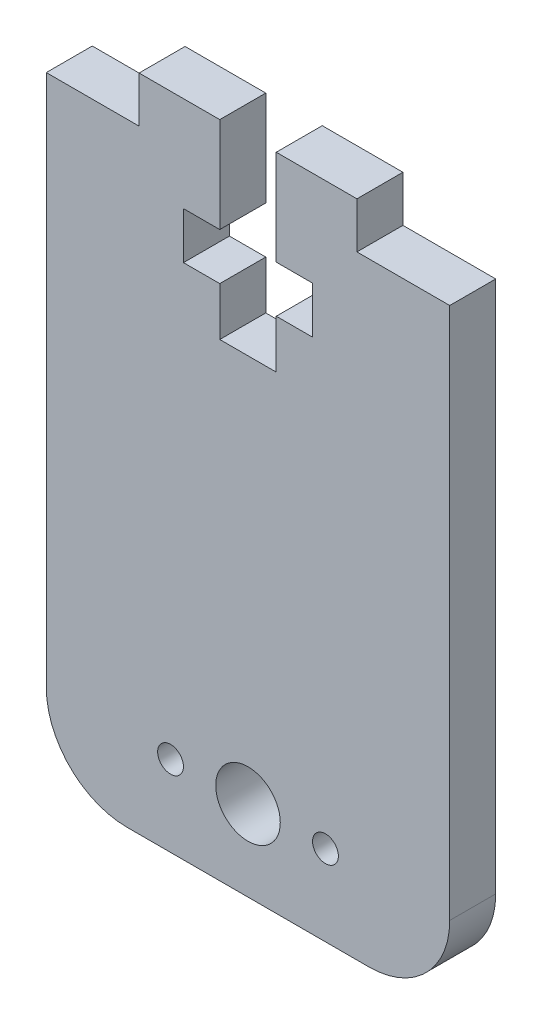
ISO-10303-21;
HEADER;
FILE_DESCRIPTION(('STEP AP214'),'2;1');
FILE_NAME('part.step','',(''),(''),'','','');
FILE_SCHEMA(('AUTOMOTIVE_DESIGN { 1 0 10303 214 1 1 1 1 }'));
ENDSEC;
DATA;
#1=APPLICATION_CONTEXT('core data for automotive mechanical design processes');
#2=APPLICATION_PROTOCOL_DEFINITION('international standard','automotive_design',2000,#1);
#3=PRODUCT_CONTEXT('',#1,'mechanical');
#4=PRODUCT('Part','Part','',(#3));
#5=PRODUCT_RELATED_PRODUCT_CATEGORY('part','',(#4));
#6=PRODUCT_DEFINITION_FORMATION('','',#4);
#7=PRODUCT_DEFINITION_CONTEXT('part definition',#1,'design');
#8=PRODUCT_DEFINITION('design','',#6,#7);
#9=PRODUCT_DEFINITION_SHAPE('','',#8);
#10=(LENGTH_UNIT() NAMED_UNIT(*) SI_UNIT(.MILLI.,.METRE.));
#11=(NAMED_UNIT(*) PLANE_ANGLE_UNIT() SI_UNIT($,.RADIAN.));
#12=(NAMED_UNIT(*) SI_UNIT($,.STERADIAN.) SOLID_ANGLE_UNIT());
#13=UNCERTAINTY_MEASURE_WITH_UNIT(LENGTH_MEASURE(1.E-05),#10,'distance_accuracy_value','');
#14=(GEOMETRIC_REPRESENTATION_CONTEXT(3) GLOBAL_UNCERTAINTY_ASSIGNED_CONTEXT((#13)) GLOBAL_UNIT_ASSIGNED_CONTEXT((#10,
#11,#12)) REPRESENTATION_CONTEXT('',''));
#15=CARTESIAN_POINT('',(0.,0.,0.));
#16=DIRECTION('',(0.,0.,1.));
#17=DIRECTION('',(1.,0.,0.));
#18=AXIS2_PLACEMENT_3D('',#15,#16,#17);
#19=CARTESIAN_POINT('',(-4.,13.05,-1.42505));
#20=DIRECTION('',(0.,-1.,0.));
#21=DIRECTION('',(0.,0.,-1.));
#22=AXIS2_PLACEMENT_3D('',#19,#20,#21);
#23=PLANE('',#22);
#24=DIRECTION('',(1.,0.,0.));
#25=VECTOR('',#24,1.);
#26=CARTESIAN_POINT('',(0.,13.05,-1.425));
#27=LINE('',#26,#25);
#28=CARTESIAN_POINT('',(1.74999999999999,13.05,-1.425));
#29=VERTEX_POINT('',#28);
#30=CARTESIAN_POINT('',(4.,13.05,-1.425));
#31=VERTEX_POINT('',#30);
#32=EDGE_CURVE('E308',#29,#31,#27,.T.);
#33=ORIENTED_EDGE('',*,*,#32,.F.);
#34=DIRECTION('',(0.,0.,1.));
#35=VECTOR('',#34,1.);
#36=CARTESIAN_POINT('',(1.74999999999999,13.05,-1.42505));
#37=LINE('',#36,#35);
#38=CARTESIAN_POINT('',(1.74999999999999,13.05,1.425));
#39=VERTEX_POINT('',#38);
#40=EDGE_CURVE('E217',#29,#39,#37,.T.);
#41=ORIENTED_EDGE('',*,*,#40,.T.);
#42=DIRECTION('',(1.,0.,0.));
#43=VECTOR('',#42,1.);
#44=CARTESIAN_POINT('',(-4.,13.05,1.425));
#45=LINE('',#44,#43);
#46=CARTESIAN_POINT('',(4.,13.05,1.425));
#47=VERTEX_POINT('',#46);
#48=EDGE_CURVE('E233',#39,#47,#45,.T.);
#49=ORIENTED_EDGE('',*,*,#48,.T.);
#50=DIRECTION('',(0.,0.,1.));
#51=VECTOR('',#50,1.);
#52=CARTESIAN_POINT('',(4.,13.05,-1.42505));
#53=LINE('',#52,#51);
#54=EDGE_CURVE('E237',#31,#47,#53,.T.);
#55=ORIENTED_EDGE('',*,*,#54,.F.);
#56=EDGE_LOOP('',(#33,#41,#49,#55));
#57=FACE_BOUND('',#56,.T.);
#58=ADVANCED_FACE('F34',(#57),#23,.F.);
#59=CARTESIAN_POINT('',(-4.,15.95,-1.42505));
#60=DIRECTION('',(0.,1.,0.));
#61=DIRECTION('',(0.,0.,1.));
#62=AXIS2_PLACEMENT_3D('',#59,#60,#61);
#63=PLANE('',#62);
#64=DIRECTION('',(-1.,0.,0.));
#65=VECTOR('',#64,1.);
#66=CARTESIAN_POINT('',(-4.,15.95,1.425));
#67=LINE('',#66,#65);
#68=CARTESIAN_POINT('',(4.,15.95,1.425));
#69=VERTEX_POINT('',#68);
#70=CARTESIAN_POINT('',(1.74999999999999,15.95,1.425));
#71=VERTEX_POINT('',#70);
#72=EDGE_CURVE('E227',#69,#71,#67,.T.);
#73=ORIENTED_EDGE('',*,*,#72,.T.);
#74=DIRECTION('',(0.,0.,-1.));
#75=VECTOR('',#74,1.);
#76=CARTESIAN_POINT('',(1.74999999999999,15.95,-1.42505));
#77=LINE('',#76,#75);
#78=CARTESIAN_POINT('',(1.74999999999999,15.95,-1.425));
#79=VERTEX_POINT('',#78);
#80=EDGE_CURVE('E318',#71,#79,#77,.T.);
#81=ORIENTED_EDGE('',*,*,#80,.T.);
#82=DIRECTION('',(-1.,0.,0.));
#83=VECTOR('',#82,1.);
#84=CARTESIAN_POINT('',(0.,15.95,-1.425));
#85=LINE('',#84,#83);
#86=CARTESIAN_POINT('',(4.,15.95,-1.425));
#87=VERTEX_POINT('',#86);
#88=EDGE_CURVE('E301',#87,#79,#85,.T.);
#89=ORIENTED_EDGE('',*,*,#88,.F.);
#90=DIRECTION('',(0.,0.,1.));
#91=VECTOR('',#90,1.);
#92=CARTESIAN_POINT('',(4.,15.95,-1.42505));
#93=LINE('',#92,#91);
#94=EDGE_CURVE('E236',#87,#69,#93,.T.);
#95=ORIENTED_EDGE('',*,*,#94,.T.);
#96=EDGE_LOOP('',(#73,#81,#89,#95));
#97=FACE_BOUND('',#96,.T.);
#98=ADVANCED_FACE('F408',(#97),#63,.F.);
#99=CARTESIAN_POINT('',(-12.5,19.,1.425));
#100=DIRECTION('',(0.,-1.,0.));
#101=DIRECTION('',(0.,0.,-1.));
#102=AXIS2_PLACEMENT_3D('',#99,#100,#101);
#103=PLANE('',#102);
#104=DIRECTION('',(0.,0.,1.));
#105=VECTOR('',#104,1.);
#106=CARTESIAN_POINT('',(-6.75000000000001,19.,-1.425));
#107=LINE('',#106,#105);
#108=CARTESIAN_POINT('',(-6.75000000000001,19.,-1.425));
#109=VERTEX_POINT('',#108);
#110=CARTESIAN_POINT('',(-6.75000000000001,19.,1.425));
#111=VERTEX_POINT('',#110);
#112=EDGE_CURVE('E273',#109,#111,#107,.T.);
#113=ORIENTED_EDGE('',*,*,#112,.F.);
#114=DIRECTION('',(-1.,0.,0.));
#115=VECTOR('',#114,1.);
#116=CARTESIAN_POINT('',(-12.5,19.,-1.425));
#117=LINE('',#116,#115);
#118=CARTESIAN_POINT('',(-12.5,19.,-1.425));
#119=VERTEX_POINT('',#118);
#120=EDGE_CURVE('E370',#109,#119,#117,.T.);
#121=ORIENTED_EDGE('',*,*,#120,.T.);
#122=DIRECTION('',(0.,0.,-1.));
#123=VECTOR('',#122,1.);
#124=CARTESIAN_POINT('',(-12.5,19.,1.425));
#125=LINE('',#124,#123);
#126=CARTESIAN_POINT('',(-12.5,19.,1.425));
#127=VERTEX_POINT('',#126);
#128=EDGE_CURVE('E365',#127,#119,#125,.T.);
#129=ORIENTED_EDGE('',*,*,#128,.F.);
#130=DIRECTION('',(-1.,0.,0.));
#131=VECTOR('',#130,1.);
#132=CARTESIAN_POINT('',(-12.5,19.,1.425));
#133=LINE('',#132,#131);
#134=EDGE_CURVE('E348',#111,#127,#133,.T.);
#135=ORIENTED_EDGE('',*,*,#134,.F.);
#136=EDGE_LOOP('',(#113,#121,#129,#135));
#137=FACE_BOUND('',#136,.T.);
#138=ADVANCED_FACE('F393',(#137),#103,.F.);
#139=CARTESIAN_POINT('',(12.5,19.,1.425));
#140=DIRECTION('',(-1.,0.,0.));
#141=DIRECTION('',(0.,-1.,0.));
#142=AXIS2_PLACEMENT_3D('',#139,#140,#141);
#143=PLANE('',#142);
#144=DIRECTION('',(0.,1.,0.));
#145=VECTOR('',#144,1.);
#146=CARTESIAN_POINT('',(12.5,19.,1.425));
#147=LINE('',#146,#145);
#148=CARTESIAN_POINT('',(12.5,-14.,1.425));
#149=VERTEX_POINT('',#148);
#150=CARTESIAN_POINT('',(12.5,19.,1.425));
#151=VERTEX_POINT('',#150);
#152=EDGE_CURVE('E337',#149,#151,#147,.T.);
#153=ORIENTED_EDGE('',*,*,#152,.F.);
#154=DIRECTION('',(0.,0.,-1.));
#155=VECTOR('',#154,1.);
#156=CARTESIAN_POINT('',(12.5,-14.,1.425));
#157=LINE('',#156,#155);
#158=CARTESIAN_POINT('',(12.5,-14.,-1.425));
#159=VERTEX_POINT('',#158);
#160=EDGE_CURVE('E322',#149,#159,#157,.T.);
#161=ORIENTED_EDGE('',*,*,#160,.T.);
#162=DIRECTION('',(0.,1.,0.));
#163=VECTOR('',#162,1.);
#164=CARTESIAN_POINT('',(12.5,19.,-1.425));
#165=LINE('',#164,#163);
#166=CARTESIAN_POINT('',(12.5,19.,-1.425));
#167=VERTEX_POINT('',#166);
#168=EDGE_CURVE('E356',#159,#167,#165,.T.);
#169=ORIENTED_EDGE('',*,*,#168,.T.);
#170=DIRECTION('',(0.,0.,-1.));
#171=VECTOR('',#170,1.);
#172=CARTESIAN_POINT('',(12.5,19.,1.425));
#173=LINE('',#172,#171);
#174=EDGE_CURVE('E347',#151,#167,#173,.T.);
#175=ORIENTED_EDGE('',*,*,#174,.F.);
#176=EDGE_LOOP('',(#153,#161,#169,#175));
#177=FACE_BOUND('',#176,.T.);
#178=ADVANCED_FACE('F344',(#177),#143,.F.);
#179=CARTESIAN_POINT('',(6.74999999999999,19.,-1.425));
#180=VERTEX_POINT('',#179);
#181=EDGE_CURVE('E361',#167,#180,#117,.T.);
#182=ORIENTED_EDGE('',*,*,#181,.T.);
#183=DIRECTION('',(0.,0.,1.));
#184=VECTOR('',#183,1.);
#185=CARTESIAN_POINT('',(6.74999999999999,19.,-1.425));
#186=LINE('',#185,#184);
#187=CARTESIAN_POINT('',(6.74999999999999,19.,1.425));
#188=VERTEX_POINT('',#187);
#189=EDGE_CURVE('E257',#180,#188,#186,.T.);
#190=ORIENTED_EDGE('',*,*,#189,.T.);
#191=EDGE_CURVE('E380',#151,#188,#133,.T.);
#192=ORIENTED_EDGE('',*,*,#191,.F.);
#193=ORIENTED_EDGE('',*,*,#174,.T.);
#194=EDGE_LOOP('',(#182,#190,#192,#193));
#195=FACE_BOUND('',#194,.T.);
#196=ADVANCED_FACE('F398',(#195),#103,.F.);
#197=CARTESIAN_POINT('',(-12.5,19.,1.425));
#198=DIRECTION('',(1.,0.,0.));
#199=DIRECTION('',(0.,1.,0.));
#200=AXIS2_PLACEMENT_3D('',#197,#198,#199);
#201=PLANE('',#200);
#202=DIRECTION('',(0.,-1.,0.));
#203=VECTOR('',#202,1.);
#204=CARTESIAN_POINT('',(-12.5,19.,-1.425));
#205=LINE('',#204,#203);
#206=CARTESIAN_POINT('',(-12.5,-14.,-1.425));
#207=VERTEX_POINT('',#206);
#208=EDGE_CURVE('E359',#119,#207,#205,.T.);
#209=ORIENTED_EDGE('',*,*,#208,.T.);
#210=DIRECTION('',(0.,0.,-1.));
#211=VECTOR('',#210,1.);
#212=CARTESIAN_POINT('',(-12.5,-14.,1.425));
#213=LINE('',#212,#211);
#214=CARTESIAN_POINT('',(-12.5,-14.,1.425));
#215=VERTEX_POINT('',#214);
#216=EDGE_CURVE('E11',#207,#215,#213,.F.);
#217=ORIENTED_EDGE('',*,*,#216,.T.);
#218=DIRECTION('',(0.,-1.,0.));
#219=VECTOR('',#218,1.);
#220=CARTESIAN_POINT('',(-12.5,19.,1.425));
#221=LINE('',#220,#219);
#222=EDGE_CURVE('E378',#127,#215,#221,.T.);
#223=ORIENTED_EDGE('',*,*,#222,.F.);
#224=ORIENTED_EDGE('',*,*,#128,.T.);
#225=EDGE_LOOP('',(#209,#217,#223,#224));
#226=FACE_BOUND('',#225,.T.);
#227=ADVANCED_FACE('F396',(#226),#201,.F.);
#228=CARTESIAN_POINT('',(-12.5,-19.,1.425));
#229=DIRECTION('',(0.,1.,0.));
#230=DIRECTION('',(0.,0.,1.));
#231=AXIS2_PLACEMENT_3D('',#228,#229,#230);
#232=PLANE('',#231);
#233=DIRECTION('',(1.,0.,0.));
#234=VECTOR('',#233,1.);
#235=CARTESIAN_POINT('',(-12.5,-19.,-1.425));
#236=LINE('',#235,#234);
#237=CARTESIAN_POINT('',(-7.5,-19.,-1.425));
#238=VERTEX_POINT('',#237);
#239=CARTESIAN_POINT('',(7.5,-19.,-1.425));
#240=VERTEX_POINT('',#239);
#241=EDGE_CURVE('E349',#238,#240,#236,.T.);
#242=ORIENTED_EDGE('',*,*,#241,.T.);
#243=DIRECTION('',(0.,0.,-1.));
#244=VECTOR('',#243,1.);
#245=CARTESIAN_POINT('',(7.5,-19.,1.425));
#246=LINE('',#245,#244);
#247=CARTESIAN_POINT('',(7.5,-19.,1.425));
#248=VERTEX_POINT('',#247);
#249=EDGE_CURVE('E55',#240,#248,#246,.F.);
#250=ORIENTED_EDGE('',*,*,#249,.T.);
#251=DIRECTION('',(1.,0.,0.));
#252=VECTOR('',#251,1.);
#253=CARTESIAN_POINT('',(-12.5,-19.,1.425));
#254=LINE('',#253,#252);
#255=CARTESIAN_POINT('',(-7.5,-19.,1.425));
#256=VERTEX_POINT('',#255);
#257=EDGE_CURVE('E339',#256,#248,#254,.T.);
#258=ORIENTED_EDGE('',*,*,#257,.F.);
#259=DIRECTION('',(0.,0.,-1.));
#260=VECTOR('',#259,1.);
#261=CARTESIAN_POINT('',(-7.5,-19.,1.425));
#262=LINE('',#261,#260);
#263=EDGE_CURVE('E329',#256,#238,#262,.T.);
#264=ORIENTED_EDGE('',*,*,#263,.T.);
#265=EDGE_LOOP('',(#242,#250,#258,#264));
#266=FACE_BOUND('',#265,.T.);
#267=ADVANCED_FACE('F357',(#266),#232,.F.);
#268=CARTESIAN_POINT('',(0.,0.,1.425));
#269=DIRECTION('',(0.,0.,1.));
#270=DIRECTION('',(1.,0.,0.));
#271=AXIS2_PLACEMENT_3D('',#268,#269,#270);
#272=PLANE('',#271);
#273=ORIENTED_EDGE('',*,*,#257,.T.);
#274=CARTESIAN_POINT('',(7.5,-14.,1.425));
#275=DIRECTION('',(0.,0.,1.));
#276=DIRECTION('',(1.,0.,0.));
#277=AXIS2_PLACEMENT_3D('',#274,#275,#276);
#278=CIRCLE('',#277,5.);
#279=EDGE_CURVE('E42',#248,#149,#278,.T.);
#280=ORIENTED_EDGE('',*,*,#279,.T.);
#281=ORIENTED_EDGE('',*,*,#152,.T.);
#282=ORIENTED_EDGE('',*,*,#191,.T.);
#283=DIRECTION('',(0.,1.,0.));
#284=VECTOR('',#283,1.);
#285=CARTESIAN_POINT('',(6.74999999999999,19.,1.425));
#286=LINE('',#285,#284);
#287=CARTESIAN_POINT('',(6.74999999999999,21.85,1.425));
#288=VERTEX_POINT('',#287);
#289=EDGE_CURVE('E259',#188,#288,#286,.T.);
#290=ORIENTED_EDGE('',*,*,#289,.T.);
#291=DIRECTION('',(-1.,0.,0.));
#292=VECTOR('',#291,1.);
#293=CARTESIAN_POINT('',(1.75,21.85,1.425));
#294=LINE('',#293,#292);
#295=CARTESIAN_POINT('',(1.75,21.85,1.425));
#296=VERTEX_POINT('',#295);
#297=EDGE_CURVE('E251',#288,#296,#294,.T.);
#298=ORIENTED_EDGE('',*,*,#297,.T.);
#299=DIRECTION('',(0.,-1.,0.));
#300=VECTOR('',#299,1.);
#301=CARTESIAN_POINT('',(1.74999999999999,19.,1.425));
#302=LINE('',#301,#300);
#303=EDGE_CURVE('E240',#296,#71,#302,.T.);
#304=ORIENTED_EDGE('',*,*,#303,.T.);
#305=ORIENTED_EDGE('',*,*,#72,.F.);
#306=DIRECTION('',(0.,1.,0.));
#307=VECTOR('',#306,1.);
#308=CARTESIAN_POINT('',(4.,15.95,1.425));
#309=LINE('',#308,#307);
#310=EDGE_CURVE('E222',#47,#69,#309,.T.);
#311=ORIENTED_EDGE('',*,*,#310,.F.);
#312=ORIENTED_EDGE('',*,*,#48,.F.);
#313=DIRECTION('',(0.,1.,0.));
#314=VECTOR('',#313,1.);
#315=CARTESIAN_POINT('',(1.74999999999999,10.05,1.425));
#316=LINE('',#315,#314);
#317=CARTESIAN_POINT('',(1.74999999999999,10.05,1.425));
#318=VERTEX_POINT('',#317);
#319=EDGE_CURVE('E206',#318,#39,#316,.T.);
#320=ORIENTED_EDGE('',*,*,#319,.F.);
#321=DIRECTION('',(1.,0.,0.));
#322=VECTOR('',#321,1.);
#323=CARTESIAN_POINT('',(-1.75000000000001,10.05,1.425));
#324=LINE('',#323,#322);
#325=CARTESIAN_POINT('',(-1.75000000000001,10.05,1.425));
#326=VERTEX_POINT('',#325);
#327=EDGE_CURVE('E190',#326,#318,#324,.T.);
#328=ORIENTED_EDGE('',*,*,#327,.F.);
#329=DIRECTION('',(0.,-1.,0.));
#330=VECTOR('',#329,1.);
#331=CARTESIAN_POINT('',(-1.75000000000001,10.05,1.425));
#332=LINE('',#331,#330);
#333=CARTESIAN_POINT('',(-1.75000000000001,13.05,1.425));
#334=VERTEX_POINT('',#333);
#335=EDGE_CURVE('E199',#334,#326,#332,.T.);
#336=ORIENTED_EDGE('',*,*,#335,.F.);
#337=CARTESIAN_POINT('',(-4.,13.05,1.425));
#338=VERTEX_POINT('',#337);
#339=EDGE_CURVE('E234',#338,#334,#45,.T.);
#340=ORIENTED_EDGE('',*,*,#339,.F.);
#341=DIRECTION('',(0.,-1.,0.));
#342=VECTOR('',#341,1.);
#343=CARTESIAN_POINT('',(-4.,15.95,1.425));
#344=LINE('',#343,#342);
#345=CARTESIAN_POINT('',(-4.,15.95,1.425));
#346=VERTEX_POINT('',#345);
#347=EDGE_CURVE('E230',#346,#338,#344,.T.);
#348=ORIENTED_EDGE('',*,*,#347,.F.);
#349=CARTESIAN_POINT('',(-1.75000000000001,15.95,1.425));
#350=VERTEX_POINT('',#349);
#351=EDGE_CURVE('E226',#350,#346,#67,.T.);
#352=ORIENTED_EDGE('',*,*,#351,.F.);
#353=DIRECTION('',(0.,1.,0.));
#354=VECTOR('',#353,1.);
#355=CARTESIAN_POINT('',(-1.75000000000001,19.,1.425));
#356=LINE('',#355,#354);
#357=CARTESIAN_POINT('',(-1.75000000000001,21.85,1.425));
#358=VERTEX_POINT('',#357);
#359=EDGE_CURVE('E279',#350,#358,#356,.T.);
#360=ORIENTED_EDGE('',*,*,#359,.T.);
#361=DIRECTION('',(-1.,0.,0.));
#362=VECTOR('',#361,1.);
#363=CARTESIAN_POINT('',(-6.75000000000001,21.85,1.425));
#364=LINE('',#363,#362);
#365=CARTESIAN_POINT('',(-6.75000000000001,21.85,1.425));
#366=VERTEX_POINT('',#365);
#367=EDGE_CURVE('E275',#358,#366,#364,.T.);
#368=ORIENTED_EDGE('',*,*,#367,.T.);
#369=DIRECTION('',(0.,-1.,0.));
#370=VECTOR('',#369,1.);
#371=CARTESIAN_POINT('',(-6.75000000000001,19.,1.425));
#372=LINE('',#371,#370);
#373=EDGE_CURVE('E266',#366,#111,#372,.T.);
#374=ORIENTED_EDGE('',*,*,#373,.T.);
#375=ORIENTED_EDGE('',*,*,#134,.T.);
#376=ORIENTED_EDGE('',*,*,#222,.T.);
#377=CARTESIAN_POINT('',(-7.5,-14.,1.425));
#378=DIRECTION('',(0.,0.,1.));
#379=DIRECTION('',(1.,0.,0.));
#380=AXIS2_PLACEMENT_3D('',#377,#378,#379);
#381=CIRCLE('',#380,5.);
#382=EDGE_CURVE('E333',#215,#256,#381,.T.);
#383=ORIENTED_EDGE('',*,*,#382,.T.);
#384=EDGE_LOOP('',(#273,#280,#281,#282,#290,#298,#304,#305,#311,#312,#320,#328,#336,#340,#348,
#352,#360,#368,#374,#375,#376,#383));
#385=FACE_BOUND('',#384,.T.);
#386=CARTESIAN_POINT('',(4.8,-14.,1.425));
#387=DIRECTION('',(0.,0.,1.));
#388=DIRECTION('',(1.,0.,0.));
#389=AXIS2_PLACEMENT_3D('',#386,#387,#388);
#390=CIRCLE('',#389,0.800000000000001);
#391=CARTESIAN_POINT('',(5.6,-14.,1.425));
#392=VERTEX_POINT('',#391);
#393=EDGE_CURVE('E282',#392,#392,#390,.T.);
#394=ORIENTED_EDGE('',*,*,#393,.F.);
#395=EDGE_LOOP('',(#394));
#396=FACE_BOUND('',#395,.T.);
#397=CARTESIAN_POINT('',(-4.8,-14.,1.425));
#398=DIRECTION('',(0.,0.,1.));
#399=DIRECTION('',(1.,0.,0.));
#400=AXIS2_PLACEMENT_3D('',#397,#398,#399);
#401=CIRCLE('',#400,0.800000000000001);
#402=CARTESIAN_POINT('',(-4.,-14.,1.425));
#403=VERTEX_POINT('',#402);
#404=EDGE_CURVE('E691',#403,#403,#401,.T.);
#405=ORIENTED_EDGE('',*,*,#404,.F.);
#406=EDGE_LOOP('',(#405));
#407=FACE_BOUND('',#406,.T.);
#408=CARTESIAN_POINT('',(0.,-14.,1.425));
#409=DIRECTION('',(0.,0.,1.));
#410=DIRECTION('',(1.,0.,0.));
#411=AXIS2_PLACEMENT_3D('',#408,#409,#410);
#412=CIRCLE('',#411,2.);
#413=CARTESIAN_POINT('',(2.,-14.,1.425));
#414=VERTEX_POINT('',#413);
#415=EDGE_CURVE('E696',#414,#414,#412,.T.);
#416=ORIENTED_EDGE('',*,*,#415,.F.);
#417=EDGE_LOOP('',(#416));
#418=FACE_BOUND('',#417,.T.);
#419=ADVANCED_FACE('F208',(#385,#396,#407,#418),#272,.T.);
#420=CARTESIAN_POINT('',(0.,0.,-1.425));
#421=DIRECTION('',(0.,0.,1.));
#422=DIRECTION('',(1.,0.,0.));
#423=AXIS2_PLACEMENT_3D('',#420,#421,#422);
#424=PLANE('',#423);
#425=CARTESIAN_POINT('',(4.8,-14.,-1.425));
#426=DIRECTION('',(0.,0.,1.));
#427=DIRECTION('',(1.,0.,0.));
#428=AXIS2_PLACEMENT_3D('',#425,#426,#427);
#429=CIRCLE('',#428,0.800000000000001);
#430=CARTESIAN_POINT('',(5.6,-14.,-1.425));
#431=VERTEX_POINT('',#430);
#432=EDGE_CURVE('E287',#431,#431,#429,.T.);
#433=ORIENTED_EDGE('',*,*,#432,.T.);
#434=EDGE_LOOP('',(#433));
#435=FACE_BOUND('',#434,.T.);
#436=CARTESIAN_POINT('',(-4.8,-14.,-1.425));
#437=DIRECTION('',(0.,0.,1.));
#438=DIRECTION('',(1.,0.,0.));
#439=AXIS2_PLACEMENT_3D('',#436,#437,#438);
#440=CIRCLE('',#439,0.800000000000001);
#441=CARTESIAN_POINT('',(-4.,-14.,-1.425));
#442=VERTEX_POINT('',#441);
#443=EDGE_CURVE('E693',#442,#442,#440,.T.);
#444=ORIENTED_EDGE('',*,*,#443,.T.);
#445=EDGE_LOOP('',(#444));
#446=FACE_BOUND('',#445,.T.);
#447=CARTESIAN_POINT('',(0.,-14.,-1.425));
#448=DIRECTION('',(0.,0.,1.));
#449=DIRECTION('',(1.,0.,0.));
#450=AXIS2_PLACEMENT_3D('',#447,#448,#449);
#451=CIRCLE('',#450,2.);
#452=CARTESIAN_POINT('',(2.,-14.,-1.425));
#453=VERTEX_POINT('',#452);
#454=EDGE_CURVE('E376',#453,#453,#451,.T.);
#455=ORIENTED_EDGE('',*,*,#454,.T.);
#456=EDGE_LOOP('',(#455));
#457=FACE_BOUND('',#456,.T.);
#458=ORIENTED_EDGE('',*,*,#168,.F.);
#459=CARTESIAN_POINT('',(7.5,-14.,-1.425));
#460=DIRECTION('',(0.,0.,1.));
#461=DIRECTION('',(1.,0.,0.));
#462=AXIS2_PLACEMENT_3D('',#459,#460,#461);
#463=CIRCLE('',#462,5.);
#464=EDGE_CURVE('E327',#159,#240,#463,.F.);
#465=ORIENTED_EDGE('',*,*,#464,.T.);
#466=ORIENTED_EDGE('',*,*,#241,.F.);
#467=CARTESIAN_POINT('',(-7.5,-14.,-1.425));
#468=DIRECTION('',(0.,0.,1.));
#469=DIRECTION('',(1.,0.,0.));
#470=AXIS2_PLACEMENT_3D('',#467,#468,#469);
#471=CIRCLE('',#470,5.);
#472=EDGE_CURVE('E325',#238,#207,#471,.F.);
#473=ORIENTED_EDGE('',*,*,#472,.T.);
#474=ORIENTED_EDGE('',*,*,#208,.F.);
#475=ORIENTED_EDGE('',*,*,#120,.F.);
#476=DIRECTION('',(0.,-1.,0.));
#477=VECTOR('',#476,1.);
#478=CARTESIAN_POINT('',(-6.75000000000001,19.,-1.425));
#479=LINE('',#478,#477);
#480=CARTESIAN_POINT('',(-6.75000000000001,21.85,-1.425));
#481=VERTEX_POINT('',#480);
#482=EDGE_CURVE('E278',#481,#109,#479,.T.);
#483=ORIENTED_EDGE('',*,*,#482,.F.);
#484=DIRECTION('',(-1.,0.,0.));
#485=VECTOR('',#484,1.);
#486=CARTESIAN_POINT('',(-6.75000000000001,21.85,-1.425));
#487=LINE('',#486,#485);
#488=CARTESIAN_POINT('',(-1.75000000000001,21.85,-1.425));
#489=VERTEX_POINT('',#488);
#490=EDGE_CURVE('E270',#489,#481,#487,.T.);
#491=ORIENTED_EDGE('',*,*,#490,.F.);
#492=DIRECTION('',(0.,1.,0.));
#493=VECTOR('',#492,1.);
#494=CARTESIAN_POINT('',(-1.75000000000001,19.,-1.425));
#495=LINE('',#494,#493);
#496=CARTESIAN_POINT('',(-1.75000000000001,15.95,-1.425));
#497=VERTEX_POINT('',#496);
#498=EDGE_CURVE('E274',#497,#489,#495,.T.);
#499=ORIENTED_EDGE('',*,*,#498,.F.);
#500=CARTESIAN_POINT('',(-4.,15.95,-1.425));
#501=VERTEX_POINT('',#500);
#502=EDGE_CURVE('E305',#497,#501,#85,.T.);
#503=ORIENTED_EDGE('',*,*,#502,.T.);
#504=DIRECTION('',(0.,-1.,0.));
#505=VECTOR('',#504,1.);
#506=CARTESIAN_POINT('',(-4.,0.,-1.425));
#507=LINE('',#506,#505);
#508=CARTESIAN_POINT('',(-4.,13.05,-1.425));
#509=VERTEX_POINT('',#508);
#510=EDGE_CURVE('E304',#501,#509,#507,.T.);
#511=ORIENTED_EDGE('',*,*,#510,.T.);
#512=CARTESIAN_POINT('',(-1.75000000000001,13.05,-1.425));
#513=VERTEX_POINT('',#512);
#514=EDGE_CURVE('E309',#509,#513,#27,.T.);
#515=ORIENTED_EDGE('',*,*,#514,.T.);
#516=DIRECTION('',(0.,-1.,0.));
#517=VECTOR('',#516,1.);
#518=CARTESIAN_POINT('',(-1.75000000000001,0.,-1.425));
#519=LINE('',#518,#517);
#520=CARTESIAN_POINT('',(-1.75000000000001,10.05,-1.425));
#521=VERTEX_POINT('',#520);
#522=EDGE_CURVE('E215',#513,#521,#519,.T.);
#523=ORIENTED_EDGE('',*,*,#522,.T.);
#524=DIRECTION('',(1.,0.,0.));
#525=VECTOR('',#524,1.);
#526=CARTESIAN_POINT('',(0.,10.05,-1.425));
#527=LINE('',#526,#525);
#528=CARTESIAN_POINT('',(1.74999999999999,10.05,-1.425));
#529=VERTEX_POINT('',#528);
#530=EDGE_CURVE('E193',#521,#529,#527,.T.);
#531=ORIENTED_EDGE('',*,*,#530,.T.);
#532=DIRECTION('',(0.,1.,0.));
#533=VECTOR('',#532,1.);
#534=CARTESIAN_POINT('',(1.74999999999999,0.,-1.425));
#535=LINE('',#534,#533);
#536=EDGE_CURVE('E219',#529,#29,#535,.T.);
#537=ORIENTED_EDGE('',*,*,#536,.T.);
#538=ORIENTED_EDGE('',*,*,#32,.T.);
#539=DIRECTION('',(0.,1.,0.));
#540=VECTOR('',#539,1.);
#541=CARTESIAN_POINT('',(4.,0.,-1.425));
#542=LINE('',#541,#540);
#543=EDGE_CURVE('E312',#31,#87,#542,.T.);
#544=ORIENTED_EDGE('',*,*,#543,.T.);
#545=ORIENTED_EDGE('',*,*,#88,.T.);
#546=DIRECTION('',(0.,-1.,0.));
#547=VECTOR('',#546,1.);
#548=CARTESIAN_POINT('',(1.74999999999999,19.,-1.425));
#549=LINE('',#548,#547);
#550=CARTESIAN_POINT('',(1.75,21.85,-1.425));
#551=VERTEX_POINT('',#550);
#552=EDGE_CURVE('E248',#551,#79,#549,.T.);
#553=ORIENTED_EDGE('',*,*,#552,.F.);
#554=DIRECTION('',(-1.,0.,0.));
#555=VECTOR('',#554,1.);
#556=CARTESIAN_POINT('',(1.75,21.85,-1.425));
#557=LINE('',#556,#555);
#558=CARTESIAN_POINT('',(6.74999999999999,21.85,-1.425));
#559=VERTEX_POINT('',#558);
#560=EDGE_CURVE('E254',#559,#551,#557,.T.);
#561=ORIENTED_EDGE('',*,*,#560,.F.);
#562=DIRECTION('',(0.,1.,0.));
#563=VECTOR('',#562,1.);
#564=CARTESIAN_POINT('',(6.74999999999999,19.,-1.425));
#565=LINE('',#564,#563);
#566=EDGE_CURVE('E250',#180,#559,#565,.T.);
#567=ORIENTED_EDGE('',*,*,#566,.F.);
#568=ORIENTED_EDGE('',*,*,#181,.F.);
#569=EDGE_LOOP('',(#458,#465,#466,#473,#474,#475,#483,#491,#499,#503,#511,#515,#523,#531,#537,
#538,#544,#545,#553,#561,#567,#568));
#570=FACE_BOUND('',#569,.T.);
#571=ADVANCED_FACE('F354',(#435,#446,#457,#570),#424,.F.);
#572=CARTESIAN_POINT('',(0.,-14.,-1.425));
#573=DIRECTION('',(0.,0.,1.));
#574=DIRECTION('',(1.,0.,0.));
#575=AXIS2_PLACEMENT_3D('',#572,#573,#574);
#576=CYLINDRICAL_SURFACE('',#575,2.);
#577=ORIENTED_EDGE('',*,*,#454,.F.);
#578=EDGE_LOOP('',(#577));
#579=FACE_BOUND('',#578,.T.);
#580=ORIENTED_EDGE('',*,*,#415,.T.);
#581=EDGE_LOOP('',(#580));
#582=FACE_BOUND('',#581,.T.);
#583=ADVANCED_FACE('F573',(#579,#582),#576,.F.);
#584=CARTESIAN_POINT('',(-4.8,-14.,-1.425));
#585=DIRECTION('',(0.,0.,1.));
#586=DIRECTION('',(1.,0.,0.));
#587=AXIS2_PLACEMENT_3D('',#584,#585,#586);
#588=CYLINDRICAL_SURFACE('',#587,0.800000000000001);
#589=ORIENTED_EDGE('',*,*,#443,.F.);
#590=EDGE_LOOP('',(#589));
#591=FACE_BOUND('',#590,.T.);
#592=ORIENTED_EDGE('',*,*,#404,.T.);
#593=EDGE_LOOP('',(#592));
#594=FACE_BOUND('',#593,.T.);
#595=ADVANCED_FACE('F591',(#591,#594),#588,.F.);
#596=CARTESIAN_POINT('',(4.8,-14.,-1.425));
#597=DIRECTION('',(0.,0.,1.));
#598=DIRECTION('',(1.,0.,0.));
#599=AXIS2_PLACEMENT_3D('',#596,#597,#598);
#600=CYLINDRICAL_SURFACE('',#599,0.800000000000001);
#601=ORIENTED_EDGE('',*,*,#432,.F.);
#602=EDGE_LOOP('',(#601));
#603=FACE_BOUND('',#602,.T.);
#604=ORIENTED_EDGE('',*,*,#393,.T.);
#605=EDGE_LOOP('',(#604));
#606=FACE_BOUND('',#605,.T.);
#607=ADVANCED_FACE('F599',(#603,#606),#600,.F.);
#608=CARTESIAN_POINT('',(-6.75000000000001,19.,-1.425));
#609=DIRECTION('',(-1.,0.,0.));
#610=DIRECTION('',(0.,-1.,0.));
#611=AXIS2_PLACEMENT_3D('',#608,#609,#610);
#612=PLANE('',#611);
#613=ORIENTED_EDGE('',*,*,#373,.F.);
#614=DIRECTION('',(0.,0.,1.));
#615=VECTOR('',#614,1.);
#616=CARTESIAN_POINT('',(-6.75000000000001,21.85,-1.425));
#617=LINE('',#616,#615);
#618=EDGE_CURVE('E280',#481,#366,#617,.T.);
#619=ORIENTED_EDGE('',*,*,#618,.F.);
#620=ORIENTED_EDGE('',*,*,#482,.T.);
#621=ORIENTED_EDGE('',*,*,#112,.T.);
#622=EDGE_LOOP('',(#613,#619,#620,#621));
#623=FACE_BOUND('',#622,.T.);
#624=ADVANCED_FACE('F453',(#623),#612,.T.);
#625=CARTESIAN_POINT('',(-6.75000000000001,21.85,-1.425));
#626=DIRECTION('',(0.,1.,0.));
#627=DIRECTION('',(0.,0.,1.));
#628=AXIS2_PLACEMENT_3D('',#625,#626,#627);
#629=PLANE('',#628);
#630=ORIENTED_EDGE('',*,*,#367,.F.);
#631=DIRECTION('',(0.,0.,1.));
#632=VECTOR('',#631,1.);
#633=CARTESIAN_POINT('',(-1.75000000000001,21.85,-1.425));
#634=LINE('',#633,#632);
#635=EDGE_CURVE('E283',#489,#358,#634,.T.);
#636=ORIENTED_EDGE('',*,*,#635,.F.);
#637=ORIENTED_EDGE('',*,*,#490,.T.);
#638=ORIENTED_EDGE('',*,*,#618,.T.);
#639=EDGE_LOOP('',(#630,#636,#637,#638));
#640=FACE_BOUND('',#639,.T.);
#641=ADVANCED_FACE('F450',(#640),#629,.T.);
#642=CARTESIAN_POINT('',(-1.75000000000001,19.,-1.425));
#643=DIRECTION('',(1.,0.,0.));
#644=DIRECTION('',(0.,1.,0.));
#645=AXIS2_PLACEMENT_3D('',#642,#643,#644);
#646=PLANE('',#645);
#647=ORIENTED_EDGE('',*,*,#359,.F.);
#648=DIRECTION('',(0.,0.,1.));
#649=VECTOR('',#648,1.);
#650=CARTESIAN_POINT('',(-1.75000000000001,15.95,-1.42505));
#651=LINE('',#650,#649);
#652=EDGE_CURVE('E315',#497,#350,#651,.T.);
#653=ORIENTED_EDGE('',*,*,#652,.F.);
#654=ORIENTED_EDGE('',*,*,#498,.T.);
#655=ORIENTED_EDGE('',*,*,#635,.T.);
#656=EDGE_LOOP('',(#647,#653,#654,#655));
#657=FACE_BOUND('',#656,.T.);
#658=ADVANCED_FACE('F444',(#657),#646,.T.);
#659=CARTESIAN_POINT('',(1.74999999999999,19.,-1.425));
#660=DIRECTION('',(-1.,0.,0.));
#661=DIRECTION('',(0.,-1.,0.));
#662=AXIS2_PLACEMENT_3D('',#659,#660,#661);
#663=PLANE('',#662);
#664=ORIENTED_EDGE('',*,*,#303,.F.);
#665=DIRECTION('',(0.,0.,1.));
#666=VECTOR('',#665,1.);
#667=CARTESIAN_POINT('',(1.75,21.85,-1.425));
#668=LINE('',#667,#666);
#669=EDGE_CURVE('E264',#551,#296,#668,.T.);
#670=ORIENTED_EDGE('',*,*,#669,.F.);
#671=ORIENTED_EDGE('',*,*,#552,.T.);
#672=ORIENTED_EDGE('',*,*,#80,.F.);
#673=EDGE_LOOP('',(#664,#670,#671,#672));
#674=FACE_BOUND('',#673,.T.);
#675=ADVANCED_FACE('F490',(#674),#663,.T.);
#676=CARTESIAN_POINT('',(1.75,21.85,-1.425));
#677=DIRECTION('',(0.,1.,0.));
#678=DIRECTION('',(0.,0.,1.));
#679=AXIS2_PLACEMENT_3D('',#676,#677,#678);
#680=PLANE('',#679);
#681=ORIENTED_EDGE('',*,*,#297,.F.);
#682=DIRECTION('',(0.,0.,1.));
#683=VECTOR('',#682,1.);
#684=CARTESIAN_POINT('',(6.74999999999999,21.85,-1.425));
#685=LINE('',#684,#683);
#686=EDGE_CURVE('E267',#559,#288,#685,.T.);
#687=ORIENTED_EDGE('',*,*,#686,.F.);
#688=ORIENTED_EDGE('',*,*,#560,.T.);
#689=ORIENTED_EDGE('',*,*,#669,.T.);
#690=EDGE_LOOP('',(#681,#687,#688,#689));
#691=FACE_BOUND('',#690,.T.);
#692=ADVANCED_FACE('F500',(#691),#680,.T.);
#693=CARTESIAN_POINT('',(6.74999999999999,19.,-1.425));
#694=DIRECTION('',(1.,0.,0.));
#695=DIRECTION('',(0.,1.,0.));
#696=AXIS2_PLACEMENT_3D('',#693,#694,#695);
#697=PLANE('',#696);
#698=ORIENTED_EDGE('',*,*,#289,.F.);
#699=ORIENTED_EDGE('',*,*,#189,.F.);
#700=ORIENTED_EDGE('',*,*,#566,.T.);
#701=ORIENTED_EDGE('',*,*,#686,.T.);
#702=EDGE_LOOP('',(#698,#699,#700,#701));
#703=FACE_BOUND('',#702,.T.);
#704=ADVANCED_FACE('F430',(#703),#697,.T.);
#705=CARTESIAN_POINT('',(4.,15.95,-1.42505));
#706=DIRECTION('',(1.,0.,0.));
#707=DIRECTION('',(0.,0.,-1.));
#708=AXIS2_PLACEMENT_3D('',#705,#706,#707);
#709=PLANE('',#708);
#710=ORIENTED_EDGE('',*,*,#54,.T.);
#711=ORIENTED_EDGE('',*,*,#310,.T.);
#712=ORIENTED_EDGE('',*,*,#94,.F.);
#713=ORIENTED_EDGE('',*,*,#543,.F.);
#714=EDGE_LOOP('',(#710,#711,#712,#713));
#715=FACE_BOUND('',#714,.T.);
#716=ADVANCED_FACE('F423',(#715),#709,.F.);
#717=ORIENTED_EDGE('',*,*,#339,.T.);
#718=DIRECTION('',(0.,0.,-1.));
#719=VECTOR('',#718,1.);
#720=CARTESIAN_POINT('',(-1.75000000000001,13.05,-1.42505));
#721=LINE('',#720,#719);
#722=EDGE_CURVE('E202',#334,#513,#721,.T.);
#723=ORIENTED_EDGE('',*,*,#722,.T.);
#724=ORIENTED_EDGE('',*,*,#514,.F.);
#725=DIRECTION('',(0.,0.,1.));
#726=VECTOR('',#725,1.);
#727=CARTESIAN_POINT('',(-4.,13.05,-1.42505));
#728=LINE('',#727,#726);
#729=EDGE_CURVE('E241',#509,#338,#728,.T.);
#730=ORIENTED_EDGE('',*,*,#729,.T.);
#731=EDGE_LOOP('',(#717,#723,#724,#730));
#732=FACE_BOUND('',#731,.T.);
#733=ADVANCED_FACE('F411',(#732),#23,.F.);
#734=CARTESIAN_POINT('',(-4.,15.95,-1.42505));
#735=DIRECTION('',(-1.,0.,0.));
#736=DIRECTION('',(0.,0.,1.));
#737=AXIS2_PLACEMENT_3D('',#734,#735,#736);
#738=PLANE('',#737);
#739=DIRECTION('',(0.,0.,1.));
#740=VECTOR('',#739,1.);
#741=CARTESIAN_POINT('',(-4.,15.95,-1.42505));
#742=LINE('',#741,#740);
#743=EDGE_CURVE('E243',#501,#346,#742,.T.);
#744=ORIENTED_EDGE('',*,*,#743,.T.);
#745=ORIENTED_EDGE('',*,*,#347,.T.);
#746=ORIENTED_EDGE('',*,*,#729,.F.);
#747=ORIENTED_EDGE('',*,*,#510,.F.);
#748=EDGE_LOOP('',(#744,#745,#746,#747));
#749=FACE_BOUND('',#748,.T.);
#750=ADVANCED_FACE('F422',(#749),#738,.F.);
#751=ORIENTED_EDGE('',*,*,#502,.F.);
#752=ORIENTED_EDGE('',*,*,#652,.T.);
#753=ORIENTED_EDGE('',*,*,#351,.T.);
#754=ORIENTED_EDGE('',*,*,#743,.F.);
#755=EDGE_LOOP('',(#751,#752,#753,#754));
#756=FACE_BOUND('',#755,.T.);
#757=ADVANCED_FACE('F417',(#756),#63,.F.);
#758=CARTESIAN_POINT('',(-1.75000000000001,10.05,-1.42505));
#759=DIRECTION('',(0.,-1.,0.));
#760=DIRECTION('',(0.,0.,-1.));
#761=AXIS2_PLACEMENT_3D('',#758,#759,#760);
#762=PLANE('',#761);
#763=DIRECTION('',(0.,0.,1.));
#764=VECTOR('',#763,1.);
#765=CARTESIAN_POINT('',(-1.75000000000001,10.05,-1.42505));
#766=LINE('',#765,#764);
#767=EDGE_CURVE('E185',#521,#326,#766,.T.);
#768=ORIENTED_EDGE('',*,*,#767,.T.);
#769=ORIENTED_EDGE('',*,*,#327,.T.);
#770=DIRECTION('',(0.,0.,1.));
#771=VECTOR('',#770,1.);
#772=CARTESIAN_POINT('',(1.74999999999999,10.05,-1.42505));
#773=LINE('',#772,#771);
#774=EDGE_CURVE('E196',#529,#318,#773,.T.);
#775=ORIENTED_EDGE('',*,*,#774,.F.);
#776=ORIENTED_EDGE('',*,*,#530,.F.);
#777=EDGE_LOOP('',(#768,#769,#775,#776));
#778=FACE_BOUND('',#777,.T.);
#779=ADVANCED_FACE('F187',(#778),#762,.F.);
#780=CARTESIAN_POINT('',(1.74999999999999,10.05,-1.42505));
#781=DIRECTION('',(1.,0.,0.));
#782=DIRECTION('',(0.,0.,-1.));
#783=AXIS2_PLACEMENT_3D('',#780,#781,#782);
#784=PLANE('',#783);
#785=ORIENTED_EDGE('',*,*,#774,.T.);
#786=ORIENTED_EDGE('',*,*,#319,.T.);
#787=ORIENTED_EDGE('',*,*,#40,.F.);
#788=ORIENTED_EDGE('',*,*,#536,.F.);
#789=EDGE_LOOP('',(#785,#786,#787,#788));
#790=FACE_BOUND('',#789,.T.);
#791=ADVANCED_FACE('F462',(#790),#784,.F.);
#792=CARTESIAN_POINT('',(-1.75000000000001,10.05,-1.42505));
#793=DIRECTION('',(-1.,0.,0.));
#794=DIRECTION('',(0.,0.,1.));
#795=AXIS2_PLACEMENT_3D('',#792,#793,#794);
#796=PLANE('',#795);
#797=ORIENTED_EDGE('',*,*,#722,.F.);
#798=ORIENTED_EDGE('',*,*,#335,.T.);
#799=ORIENTED_EDGE('',*,*,#767,.F.);
#800=ORIENTED_EDGE('',*,*,#522,.F.);
#801=EDGE_LOOP('',(#797,#798,#799,#800));
#802=FACE_BOUND('',#801,.T.);
#803=ADVANCED_FACE('F200',(#802),#796,.F.);
#804=CARTESIAN_POINT('',(7.5,-14.,1.425));
#805=DIRECTION('',(0.,0.,-1.));
#806=DIRECTION('',(-1.,0.,0.));
#807=AXIS2_PLACEMENT_3D('',#804,#805,#806);
#808=CYLINDRICAL_SURFACE('',#807,5.);
#809=ORIENTED_EDGE('',*,*,#279,.F.);
#810=ORIENTED_EDGE('',*,*,#249,.F.);
#811=ORIENTED_EDGE('',*,*,#464,.F.);
#812=ORIENTED_EDGE('',*,*,#160,.F.);
#813=EDGE_LOOP('',(#809,#810,#811,#812));
#814=FACE_BOUND('',#813,.T.);
#815=ADVANCED_FACE('F351',(#814),#808,.T.);
#816=CARTESIAN_POINT('',(-7.5,-14.,1.425));
#817=DIRECTION('',(0.,0.,-1.));
#818=DIRECTION('',(-1.,0.,0.));
#819=AXIS2_PLACEMENT_3D('',#816,#817,#818);
#820=CYLINDRICAL_SURFACE('',#819,5.);
#821=ORIENTED_EDGE('',*,*,#382,.F.);
#822=ORIENTED_EDGE('',*,*,#216,.F.);
#823=ORIENTED_EDGE('',*,*,#472,.F.);
#824=ORIENTED_EDGE('',*,*,#263,.F.);
#825=EDGE_LOOP('',(#821,#822,#823,#824));
#826=FACE_BOUND('',#825,.T.);
#827=ADVANCED_FACE('F36',(#826),#820,.T.);
#828=CLOSED_SHELL('',(#58,#98,#138,#178,#196,#227,#267,#419,#571,#583,#595,#607,#624,#641,#658,
#675,#692,#704,#716,#733,#750,#757,#779,#791,#803,#815,#827));
#829=MANIFOLD_SOLID_BREP('B2',#828);
#830=ADVANCED_BREP_SHAPE_REPRESENTATION('',(#18,#829),#14);
#831=SHAPE_DEFINITION_REPRESENTATION(#9,#830);
ENDSEC;
END-ISO-10303-21;
